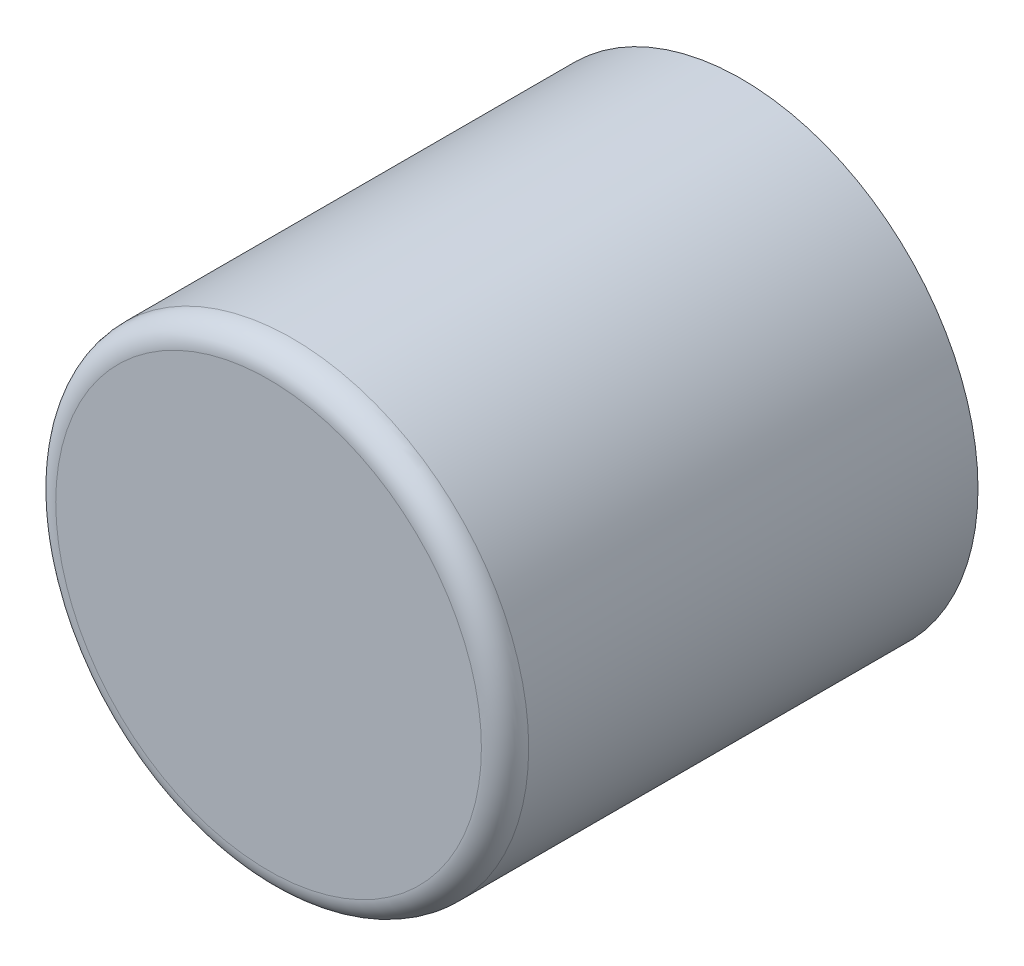
ISO-10303-21;
HEADER;
FILE_DESCRIPTION(('STEP AP214'),'2;1');
FILE_NAME('part.step','',(''),(''),'','','');
FILE_SCHEMA(('AUTOMOTIVE_DESIGN { 1 0 10303 214 1 1 1 1 }'));
ENDSEC;
DATA;
#1=APPLICATION_CONTEXT('core data for automotive mechanical design processes');
#2=APPLICATION_PROTOCOL_DEFINITION('international standard','automotive_design',2000,#1);
#3=PRODUCT_CONTEXT('',#1,'mechanical');
#4=PRODUCT('Part','Part','',(#3));
#5=PRODUCT_RELATED_PRODUCT_CATEGORY('part','',(#4));
#6=PRODUCT_DEFINITION_FORMATION('','',#4);
#7=PRODUCT_DEFINITION_CONTEXT('part definition',#1,'design');
#8=PRODUCT_DEFINITION('design','',#6,#7);
#9=PRODUCT_DEFINITION_SHAPE('','',#8);
#10=(LENGTH_UNIT() NAMED_UNIT(*) SI_UNIT(.MILLI.,.METRE.));
#11=(NAMED_UNIT(*) PLANE_ANGLE_UNIT() SI_UNIT($,.RADIAN.));
#12=(NAMED_UNIT(*) SI_UNIT($,.STERADIAN.) SOLID_ANGLE_UNIT());
#13=UNCERTAINTY_MEASURE_WITH_UNIT(LENGTH_MEASURE(1.E-05),#10,'distance_accuracy_value','');
#14=(GEOMETRIC_REPRESENTATION_CONTEXT(3) GLOBAL_UNCERTAINTY_ASSIGNED_CONTEXT((#13)) GLOBAL_UNIT_ASSIGNED_CONTEXT((#10,
#11,#12)) REPRESENTATION_CONTEXT('',''));
#15=CARTESIAN_POINT('',(0.,0.,0.));
#16=DIRECTION('',(0.,0.,1.));
#17=DIRECTION('',(1.,0.,0.));
#18=AXIS2_PLACEMENT_3D('',#15,#16,#17);
#19=CARTESIAN_POINT('',(0.667795601830878,2.70262562244971,1.));
#20=DIRECTION('',(0.,0.,-1.));
#21=DIRECTION('',(-1.,0.,0.));
#22=AXIS2_PLACEMENT_3D('',#19,#20,#21);
#23=CYLINDRICAL_SURFACE('',#22,1.);
#24=CARTESIAN_POINT('',(0.667795601830878,2.70262562244971,0.9));
#25=DIRECTION('',(0.,0.,1.));
#26=DIRECTION('',(1.,0.,0.));
#27=AXIS2_PLACEMENT_3D('',#24,#25,#26);
#28=CIRCLE('',#27,1.);
#29=CARTESIAN_POINT('',(1.66779560183088,2.70262562244971,0.9));
#30=VERTEX_POINT('',#29);
#31=EDGE_CURVE('E10',#30,#30,#28,.F.);
#32=ORIENTED_EDGE('',*,*,#31,.T.);
#33=EDGE_LOOP('',(#32));
#34=FACE_BOUND('',#33,.T.);
#35=CARTESIAN_POINT('',(0.667795601830878,2.70262562244971,-1.));
#36=DIRECTION('',(0.,0.,1.));
#37=DIRECTION('',(1.,0.,0.));
#38=AXIS2_PLACEMENT_3D('',#35,#36,#37);
#39=CIRCLE('',#38,1.);
#40=CARTESIAN_POINT('',(1.66779560183088,2.70262562244971,-1.));
#41=VERTEX_POINT('',#40);
#42=EDGE_CURVE('E48',#41,#41,#39,.T.);
#43=ORIENTED_EDGE('',*,*,#42,.T.);
#44=EDGE_LOOP('',(#43));
#45=FACE_BOUND('',#44,.T.);
#46=ADVANCED_FACE('F37',(#34,#45),#23,.T.);
#47=CARTESIAN_POINT('',(0.667795601830878,2.70262562244971,1.));
#48=DIRECTION('',(0.,0.,1.));
#49=DIRECTION('',(1.,0.,0.));
#50=AXIS2_PLACEMENT_3D('',#47,#48,#49);
#51=PLANE('',#50);
#52=CARTESIAN_POINT('',(0.667795601830878,2.70262562244971,1.));
#53=DIRECTION('',(0.,0.,1.));
#54=DIRECTION('',(1.,0.,0.));
#55=AXIS2_PLACEMENT_3D('',#52,#53,#54);
#56=CIRCLE('',#55,0.9);
#57=CARTESIAN_POINT('',(1.56779560183088,2.70262562244971,1.));
#58=VERTEX_POINT('',#57);
#59=EDGE_CURVE('E44',#58,#58,#56,.T.);
#60=ORIENTED_EDGE('',*,*,#59,.T.);
#61=EDGE_LOOP('',(#60));
#62=FACE_BOUND('',#61,.T.);
#63=ADVANCED_FACE('F58',(#62),#51,.T.);
#64=CARTESIAN_POINT('',(0.667795601830878,2.70262562244971,-1.));
#65=DIRECTION('',(0.,0.,1.));
#66=DIRECTION('',(1.,0.,0.));
#67=AXIS2_PLACEMENT_3D('',#64,#65,#66);
#68=PLANE('',#67);
#69=ORIENTED_EDGE('',*,*,#42,.F.);
#70=EDGE_LOOP('',(#69));
#71=FACE_BOUND('',#70,.T.);
#72=ADVANCED_FACE('F56',(#71),#68,.F.);
#73=CARTESIAN_POINT('',(0.667795601830878,2.70262562244971,0.9));
#74=DIRECTION('',(0.,0.,1.));
#75=DIRECTION('',(1.,0.,0.));
#76=AXIS2_PLACEMENT_3D('',#73,#74,#75);
#77=TOROIDAL_SURFACE('',#76,0.9,0.1);
#78=ORIENTED_EDGE('',*,*,#31,.F.);
#79=EDGE_LOOP('',(#78));
#80=FACE_BOUND('',#79,.T.);
#81=ORIENTED_EDGE('',*,*,#59,.F.);
#82=EDGE_LOOP('',(#81));
#83=FACE_BOUND('',#82,.T.);
#84=ADVANCED_FACE('F39',(#80,#83),#77,.T.);
#85=CLOSED_SHELL('',(#46,#63,#72,#84));
#86=MANIFOLD_SOLID_BREP('B2',#85);
#87=ADVANCED_BREP_SHAPE_REPRESENTATION('',(#18,#86),#14);
#88=SHAPE_DEFINITION_REPRESENTATION(#9,#87);
ENDSEC;
END-ISO-10303-21;
